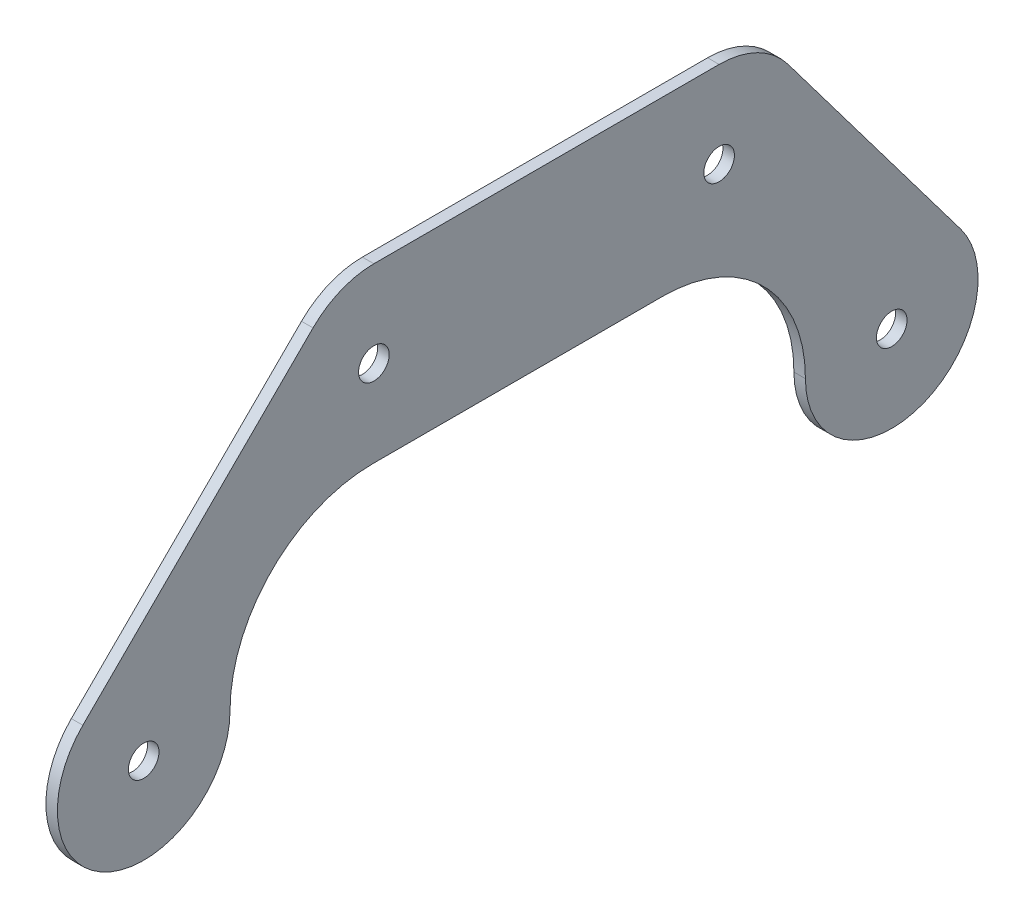
ISO-10303-21;
HEADER;
FILE_DESCRIPTION(('STEP AP214'),'2;1');
FILE_NAME('part.step','',(''),(''),'','','');
FILE_SCHEMA(('AUTOMOTIVE_DESIGN { 1 0 10303 214 1 1 1 1 }'));
ENDSEC;
DATA;
#1=APPLICATION_CONTEXT('core data for automotive mechanical design processes');
#2=APPLICATION_PROTOCOL_DEFINITION('international standard','automotive_design',2000,#1);
#3=PRODUCT_CONTEXT('',#1,'mechanical');
#4=PRODUCT('Part','Part','',(#3));
#5=PRODUCT_RELATED_PRODUCT_CATEGORY('part','',(#4));
#6=PRODUCT_DEFINITION_FORMATION('','',#4);
#7=PRODUCT_DEFINITION_CONTEXT('part definition',#1,'design');
#8=PRODUCT_DEFINITION('design','',#6,#7);
#9=PRODUCT_DEFINITION_SHAPE('','',#8);
#10=(LENGTH_UNIT() NAMED_UNIT(*) SI_UNIT(.MILLI.,.METRE.));
#11=(NAMED_UNIT(*) PLANE_ANGLE_UNIT() SI_UNIT($,.RADIAN.));
#12=(NAMED_UNIT(*) SI_UNIT($,.STERADIAN.) SOLID_ANGLE_UNIT());
#13=UNCERTAINTY_MEASURE_WITH_UNIT(LENGTH_MEASURE(1.E-05),#10,'distance_accuracy_value','');
#14=(GEOMETRIC_REPRESENTATION_CONTEXT(3) GLOBAL_UNCERTAINTY_ASSIGNED_CONTEXT((#13)) GLOBAL_UNIT_ASSIGNED_CONTEXT((#10,
#11,#12)) REPRESENTATION_CONTEXT('',''));
#15=CARTESIAN_POINT('',(0.,0.,0.));
#16=DIRECTION('',(0.,0.,1.));
#17=DIRECTION('',(1.,0.,0.));
#18=AXIS2_PLACEMENT_3D('',#15,#16,#17);
#19=CARTESIAN_POINT('',(2.54,13.5041021309131,13.4365816202585));
#20=DIRECTION('',(0.,0.708876752278901,0.705332368517507));
#21=DIRECTION('',(0.,-0.705332368517507,0.708876752278901));
#22=AXIS2_PLACEMENT_3D('',#19,#20,#21);
#23=PLANE('',#22);
#24=DIRECTION('',(0.,0.705332368517508,-0.708876752278902));
#25=VECTOR('',#24,1.);
#26=CARTESIAN_POINT('',(0.,13.5041021309131,13.4365816202585));
#27=LINE('',#26,#25);
#28=CARTESIAN_POINT('',(0.,13.5041021309131,13.4365816202585));
#29=VERTEX_POINT('',#28);
#30=CARTESIAN_POINT('',(0.,64.0501021309131,-37.3634183797415));
#31=VERTEX_POINT('',#30);
#32=EDGE_CURVE('E164',#29,#31,#27,.T.);
#33=ORIENTED_EDGE('',*,*,#32,.F.);
#34=DIRECTION('',(-1.,0.,0.));
#35=VECTOR('',#34,1.);
#36=CARTESIAN_POINT('',(2.54,13.5041021309131,13.4365816202585));
#37=LINE('',#36,#35);
#38=CARTESIAN_POINT('',(2.54,13.5041021309131,13.4365816202585));
#39=VERTEX_POINT('',#38);
#40=EDGE_CURVE('E11',#39,#29,#37,.T.);
#41=ORIENTED_EDGE('',*,*,#40,.F.);
#42=DIRECTION('',(0.,0.705332368517508,-0.708876752278902));
#43=VECTOR('',#42,1.);
#44=CARTESIAN_POINT('',(2.54,13.5041021309131,13.4365816202585));
#45=LINE('',#44,#43);
#46=CARTESIAN_POINT('',(2.54,64.0501021309131,-37.3634183797415));
#47=VERTEX_POINT('',#46);
#48=EDGE_CURVE('E197',#39,#47,#45,.T.);
#49=ORIENTED_EDGE('',*,*,#48,.T.);
#50=DIRECTION('',(-1.,0.,0.));
#51=VECTOR('',#50,1.);
#52=CARTESIAN_POINT('',(2.54,64.0501021309131,-37.3634183797415));
#53=LINE('',#52,#51);
#54=EDGE_CURVE('E44',#47,#31,#53,.T.);
#55=ORIENTED_EDGE('',*,*,#54,.T.);
#56=EDGE_LOOP('',(#33,#41,#49,#55));
#57=FACE_BOUND('',#56,.T.);
#58=ADVANCED_FACE('F41',(#57),#23,.T.);
#59=CARTESIAN_POINT('',(2.54,0.,0.));
#60=DIRECTION('',(-1.,0.,0.));
#61=DIRECTION('',(0.,0.,1.));
#62=AXIS2_PLACEMENT_3D('',#59,#60,#61);
#63=CYLINDRICAL_SURFACE('',#62,19.05);
#64=CARTESIAN_POINT('',(0.,0.,0.));
#65=DIRECTION('',(1.,0.,0.));
#66=DIRECTION('',(0.,0.,-1.));
#67=AXIS2_PLACEMENT_3D('',#64,#65,#66);
#68=CIRCLE('',#67,19.05);
#69=CARTESIAN_POINT('',(0.,0.,-19.05));
#70=VERTEX_POINT('',#69);
#71=EDGE_CURVE('E196',#29,#70,#68,.T.);
#72=ORIENTED_EDGE('',*,*,#71,.T.);
#73=DIRECTION('',(-1.,0.,0.));
#74=VECTOR('',#73,1.);
#75=CARTESIAN_POINT('',(2.54,0.,-19.05));
#76=LINE('',#75,#74);
#77=CARTESIAN_POINT('',(2.54,0.,-19.05));
#78=VERTEX_POINT('',#77);
#79=EDGE_CURVE('E50',#78,#70,#76,.T.);
#80=ORIENTED_EDGE('',*,*,#79,.F.);
#81=CARTESIAN_POINT('',(2.54,0.,0.));
#82=DIRECTION('',(1.,0.,0.));
#83=DIRECTION('',(0.,0.,-1.));
#84=AXIS2_PLACEMENT_3D('',#81,#82,#83);
#85=CIRCLE('',#84,19.05);
#86=EDGE_CURVE('E155',#39,#78,#85,.T.);
#87=ORIENTED_EDGE('',*,*,#86,.F.);
#88=ORIENTED_EDGE('',*,*,#40,.T.);
#89=EDGE_LOOP('',(#72,#80,#87,#88));
#90=FACE_BOUND('',#89,.T.);
#91=ADVANCED_FACE('F223',(#90),#63,.T.);
#92=CARTESIAN_POINT('',(2.54,0.,-50.546));
#93=DIRECTION('',(-1.,0.,0.));
#94=DIRECTION('',(0.,0.,1.));
#95=AXIS2_PLACEMENT_3D('',#92,#93,#94);
#96=CYLINDRICAL_SURFACE('',#95,31.496);
#97=CARTESIAN_POINT('',(0.,0.,-50.546));
#98=DIRECTION('',(1.,0.,0.));
#99=DIRECTION('',(0.,0.,-1.));
#100=AXIS2_PLACEMENT_3D('',#97,#98,#99);
#101=CIRCLE('',#100,31.496);
#102=CARTESIAN_POINT('',(0.,31.496,-50.546));
#103=VERTEX_POINT('',#102);
#104=EDGE_CURVE('E141',#103,#70,#101,.T.);
#105=ORIENTED_EDGE('',*,*,#104,.F.);
#106=DIRECTION('',(-1.,0.,0.));
#107=VECTOR('',#106,1.);
#108=CARTESIAN_POINT('',(2.54,31.496,-50.546));
#109=LINE('',#108,#107);
#110=CARTESIAN_POINT('',(2.54,31.496,-50.546));
#111=VERTEX_POINT('',#110);
#112=EDGE_CURVE('E135',#111,#103,#109,.T.);
#113=ORIENTED_EDGE('',*,*,#112,.F.);
#114=CARTESIAN_POINT('',(2.54,0.,-50.546));
#115=DIRECTION('',(1.,0.,0.));
#116=DIRECTION('',(0.,0.,-1.));
#117=AXIS2_PLACEMENT_3D('',#114,#115,#116);
#118=CIRCLE('',#117,31.496);
#119=EDGE_CURVE('E139',#111,#78,#118,.T.);
#120=ORIENTED_EDGE('',*,*,#119,.T.);
#121=ORIENTED_EDGE('',*,*,#79,.T.);
#122=EDGE_LOOP('',(#105,#113,#120,#121));
#123=FACE_BOUND('',#122,.T.);
#124=ADVANCED_FACE('F137',(#123),#96,.F.);
#125=CARTESIAN_POINT('',(2.54,31.496,-50.546));
#126=DIRECTION('',(0.,1.,0.));
#127=DIRECTION('',(0.,0.,1.));
#128=AXIS2_PLACEMENT_3D('',#125,#126,#127);
#129=PLANE('',#128);
#130=DIRECTION('',(0.,0.,-1.));
#131=VECTOR('',#130,1.);
#132=CARTESIAN_POINT('',(0.,31.496,-50.546));
#133=LINE('',#132,#131);
#134=CARTESIAN_POINT('',(0.,31.496,-114.554));
#135=VERTEX_POINT('',#134);
#136=EDGE_CURVE('E192',#103,#135,#133,.T.);
#137=ORIENTED_EDGE('',*,*,#136,.T.);
#138=DIRECTION('',(-1.,0.,0.));
#139=VECTOR('',#138,1.);
#140=CARTESIAN_POINT('',(2.54,31.496,-114.554));
#141=LINE('',#140,#139);
#142=CARTESIAN_POINT('',(2.54,31.496,-114.554));
#143=VERTEX_POINT('',#142);
#144=EDGE_CURVE('E145',#143,#135,#141,.T.);
#145=ORIENTED_EDGE('',*,*,#144,.F.);
#146=DIRECTION('',(0.,0.,-1.));
#147=VECTOR('',#146,1.);
#148=CARTESIAN_POINT('',(2.54,31.496,-50.546));
#149=LINE('',#148,#147);
#150=EDGE_CURVE('E148',#111,#143,#149,.T.);
#151=ORIENTED_EDGE('',*,*,#150,.F.);
#152=ORIENTED_EDGE('',*,*,#112,.T.);
#153=EDGE_LOOP('',(#137,#145,#151,#152));
#154=FACE_BOUND('',#153,.T.);
#155=ADVANCED_FACE('F149',(#154),#129,.F.);
#156=CARTESIAN_POINT('',(2.54,-2.61325812841072E-13,-114.554));
#157=DIRECTION('',(-1.,0.,0.));
#158=DIRECTION('',(0.,0.,1.));
#159=AXIS2_PLACEMENT_3D('',#156,#157,#158);
#160=CYLINDRICAL_SURFACE('',#159,31.4960000000003);
#161=CARTESIAN_POINT('',(0.,-2.61325812841072E-13,-114.554));
#162=DIRECTION('',(1.,0.,0.));
#163=DIRECTION('',(0.,0.,-1.));
#164=AXIS2_PLACEMENT_3D('',#161,#162,#163);
#165=CIRCLE('',#164,31.4960000000003);
#166=CARTESIAN_POINT('',(0.,0.,-146.05));
#167=VERTEX_POINT('',#166);
#168=EDGE_CURVE('E189',#167,#135,#165,.T.);
#169=ORIENTED_EDGE('',*,*,#168,.F.);
#170=DIRECTION('',(-1.,0.,0.));
#171=VECTOR('',#170,1.);
#172=CARTESIAN_POINT('',(2.54,0.,-146.05));
#173=LINE('',#172,#171);
#174=CARTESIAN_POINT('',(2.54,0.,-146.05));
#175=VERTEX_POINT('',#174);
#176=EDGE_CURVE('E201',#175,#167,#173,.T.);
#177=ORIENTED_EDGE('',*,*,#176,.F.);
#178=CARTESIAN_POINT('',(2.54,-2.61325812841072E-13,-114.554));
#179=DIRECTION('',(1.,0.,0.));
#180=DIRECTION('',(0.,0.,-1.));
#181=AXIS2_PLACEMENT_3D('',#178,#179,#180);
#182=CIRCLE('',#181,31.4960000000003);
#183=EDGE_CURVE('E152',#175,#143,#182,.T.);
#184=ORIENTED_EDGE('',*,*,#183,.T.);
#185=ORIENTED_EDGE('',*,*,#144,.T.);
#186=EDGE_LOOP('',(#169,#177,#184,#185));
#187=FACE_BOUND('',#186,.T.);
#188=ADVANCED_FACE('F251',(#187),#160,.F.);
#189=CARTESIAN_POINT('',(2.54,1.38777878078145E-13,-165.1));
#190=DIRECTION('',(-1.,0.,0.));
#191=DIRECTION('',(0.,0.,1.));
#192=AXIS2_PLACEMENT_3D('',#189,#190,#191);
#193=CYLINDRICAL_SURFACE('',#192,19.05);
#194=CARTESIAN_POINT('',(0.,1.38777878078145E-13,-165.1));
#195=DIRECTION('',(1.,0.,0.));
#196=DIRECTION('',(0.,0.,-1.));
#197=AXIS2_PLACEMENT_3D('',#194,#195,#196);
#198=CIRCLE('',#197,19.05);
#199=CARTESIAN_POINT('',(0.,11.4666601826353,-180.312435842296));
#200=VERTEX_POINT('',#199);
#201=EDGE_CURVE('E185',#167,#200,#198,.T.);
#202=ORIENTED_EDGE('',*,*,#201,.T.);
#203=DIRECTION('',(-1.,0.,0.));
#204=VECTOR('',#203,1.);
#205=CARTESIAN_POINT('',(2.54,11.4666601826353,-180.312435842296));
#206=LINE('',#205,#204);
#207=CARTESIAN_POINT('',(2.54,11.4666601826353,-180.312435842296));
#208=VERTEX_POINT('',#207);
#209=EDGE_CURVE('E204',#208,#200,#206,.T.);
#210=ORIENTED_EDGE('',*,*,#209,.F.);
#211=CARTESIAN_POINT('',(2.54,1.38777878078145E-13,-165.1));
#212=DIRECTION('',(1.,0.,0.));
#213=DIRECTION('',(0.,0.,-1.));
#214=AXIS2_PLACEMENT_3D('',#211,#212,#213);
#215=CIRCLE('',#214,19.05);
#216=EDGE_CURVE('E245',#175,#208,#215,.T.);
#217=ORIENTED_EDGE('',*,*,#216,.F.);
#218=ORIENTED_EDGE('',*,*,#176,.T.);
#219=EDGE_LOOP('',(#202,#210,#217,#218));
#220=FACE_BOUND('',#219,.T.);
#221=ADVANCED_FACE('F256',(#220),#193,.T.);
#222=CARTESIAN_POINT('',(2.54,62.0126601826352,-142.212435842296));
#223=DIRECTION('',(0.,0.601924419035966,-0.798553062587712));
#224=DIRECTION('',(0.,0.798553062587712,0.601924419035966));
#225=AXIS2_PLACEMENT_3D('',#222,#223,#224);
#226=PLANE('',#225);
#227=DIRECTION('',(0.,-0.798553062587712,-0.601924419035966));
#228=VECTOR('',#227,1.);
#229=CARTESIAN_POINT('',(0.,62.0126601826352,-142.212435842296));
#230=LINE('',#229,#228);
#231=CARTESIAN_POINT('',(0.,62.0126601826352,-142.212435842296));
#232=VERTEX_POINT('',#231);
#233=EDGE_CURVE('E181',#232,#200,#230,.T.);
#234=ORIENTED_EDGE('',*,*,#233,.F.);
#235=DIRECTION('',(-1.,0.,0.));
#236=VECTOR('',#235,1.);
#237=CARTESIAN_POINT('',(2.54,62.0126601826352,-142.212435842296));
#238=LINE('',#237,#236);
#239=CARTESIAN_POINT('',(2.54,62.0126601826352,-142.212435842296));
#240=VERTEX_POINT('',#239);
#241=EDGE_CURVE('E207',#240,#232,#238,.T.);
#242=ORIENTED_EDGE('',*,*,#241,.F.);
#243=DIRECTION('',(0.,-0.798553062587712,-0.601924419035966));
#244=VECTOR('',#243,1.);
#245=CARTESIAN_POINT('',(2.54,62.0126601826352,-142.212435842296));
#246=LINE('',#245,#244);
#247=EDGE_CURVE('E241',#240,#208,#246,.T.);
#248=ORIENTED_EDGE('',*,*,#247,.T.);
#249=ORIENTED_EDGE('',*,*,#209,.T.);
#250=EDGE_LOOP('',(#234,#242,#248,#249));
#251=FACE_BOUND('',#250,.T.);
#252=ADVANCED_FACE('F260',(#251),#226,.T.);
#253=CARTESIAN_POINT('',(2.54,50.546,-127.));
#254=DIRECTION('',(-1.,0.,0.));
#255=DIRECTION('',(0.,0.,1.));
#256=AXIS2_PLACEMENT_3D('',#253,#254,#255);
#257=CYLINDRICAL_SURFACE('',#256,19.05);
#258=CARTESIAN_POINT('',(0.,50.546,-127.));
#259=DIRECTION('',(1.,0.,0.));
#260=DIRECTION('',(0.,0.,-1.));
#261=AXIS2_PLACEMENT_3D('',#258,#259,#260);
#262=CIRCLE('',#261,19.05);
#263=CARTESIAN_POINT('',(0.,69.596,-127.));
#264=VERTEX_POINT('',#263);
#265=EDGE_CURVE('E177',#232,#264,#262,.T.);
#266=ORIENTED_EDGE('',*,*,#265,.T.);
#267=DIRECTION('',(-1.,0.,0.));
#268=VECTOR('',#267,1.);
#269=CARTESIAN_POINT('',(2.54,69.596,-127.));
#270=LINE('',#269,#268);
#271=CARTESIAN_POINT('',(2.54,69.596,-127.));
#272=VERTEX_POINT('',#271);
#273=EDGE_CURVE('E210',#272,#264,#270,.T.);
#274=ORIENTED_EDGE('',*,*,#273,.F.);
#275=CARTESIAN_POINT('',(2.54,50.546,-127.));
#276=DIRECTION('',(1.,0.,0.));
#277=DIRECTION('',(0.,0.,-1.));
#278=AXIS2_PLACEMENT_3D('',#275,#276,#277);
#279=CIRCLE('',#278,19.05);
#280=EDGE_CURVE('E238',#240,#272,#279,.T.);
#281=ORIENTED_EDGE('',*,*,#280,.F.);
#282=ORIENTED_EDGE('',*,*,#241,.T.);
#283=EDGE_LOOP('',(#266,#274,#281,#282));
#284=FACE_BOUND('',#283,.T.);
#285=ADVANCED_FACE('F265',(#284),#257,.T.);
#286=CARTESIAN_POINT('',(2.54,69.596,-50.8));
#287=DIRECTION('',(0.,1.,0.));
#288=DIRECTION('',(0.,0.,1.));
#289=AXIS2_PLACEMENT_3D('',#286,#287,#288);
#290=PLANE('',#289);
#291=DIRECTION('',(0.,0.,-1.));
#292=VECTOR('',#291,1.);
#293=CARTESIAN_POINT('',(0.,69.596,-50.8));
#294=LINE('',#293,#292);
#295=CARTESIAN_POINT('',(0.,69.596,-50.8));
#296=VERTEX_POINT('',#295);
#297=EDGE_CURVE('E173',#296,#264,#294,.T.);
#298=ORIENTED_EDGE('',*,*,#297,.F.);
#299=DIRECTION('',(-1.,0.,0.));
#300=VECTOR('',#299,1.);
#301=CARTESIAN_POINT('',(2.54,69.596,-50.8));
#302=LINE('',#301,#300);
#303=CARTESIAN_POINT('',(2.54,69.596,-50.8));
#304=VERTEX_POINT('',#303);
#305=EDGE_CURVE('E212',#304,#296,#302,.T.);
#306=ORIENTED_EDGE('',*,*,#305,.F.);
#307=DIRECTION('',(0.,0.,-1.));
#308=VECTOR('',#307,1.);
#309=CARTESIAN_POINT('',(2.54,69.596,-50.8));
#310=LINE('',#309,#308);
#311=EDGE_CURVE('E230',#304,#272,#310,.T.);
#312=ORIENTED_EDGE('',*,*,#311,.T.);
#313=ORIENTED_EDGE('',*,*,#273,.T.);
#314=EDGE_LOOP('',(#298,#306,#312,#313));
#315=FACE_BOUND('',#314,.T.);
#316=ADVANCED_FACE('F267',(#315),#290,.T.);
#317=CARTESIAN_POINT('',(2.54,50.546,-50.8));
#318=DIRECTION('',(-1.,0.,0.));
#319=DIRECTION('',(0.,0.,1.));
#320=AXIS2_PLACEMENT_3D('',#317,#318,#319);
#321=CYLINDRICAL_SURFACE('',#320,19.05);
#322=CARTESIAN_POINT('',(0.,50.546,-50.8));
#323=DIRECTION('',(1.,0.,0.));
#324=DIRECTION('',(0.,0.,-1.));
#325=AXIS2_PLACEMENT_3D('',#322,#323,#324);
#326=CIRCLE('',#325,19.05);
#327=EDGE_CURVE('E168',#296,#31,#326,.T.);
#328=ORIENTED_EDGE('',*,*,#327,.T.);
#329=ORIENTED_EDGE('',*,*,#54,.F.);
#330=CARTESIAN_POINT('',(2.54,50.546,-50.8));
#331=DIRECTION('',(1.,0.,0.));
#332=DIRECTION('',(0.,0.,-1.));
#333=AXIS2_PLACEMENT_3D('',#330,#331,#332);
#334=CIRCLE('',#333,19.05);
#335=EDGE_CURVE('E110',#304,#47,#334,.T.);
#336=ORIENTED_EDGE('',*,*,#335,.F.);
#337=ORIENTED_EDGE('',*,*,#305,.T.);
#338=EDGE_LOOP('',(#328,#329,#336,#337));
#339=FACE_BOUND('',#338,.T.);
#340=ADVANCED_FACE('F219',(#339),#321,.T.);
#341=CARTESIAN_POINT('',(2.54,50.546,-50.8));
#342=DIRECTION('',(1.,0.,0.));
#343=DIRECTION('',(0.,0.,-1.));
#344=AXIS2_PLACEMENT_3D('',#341,#342,#343);
#345=PLANE('',#344);
#346=CARTESIAN_POINT('',(2.54,50.546,-50.8));
#347=DIRECTION('',(1.,0.,0.));
#348=DIRECTION('',(0.,0.,-1.));
#349=AXIS2_PLACEMENT_3D('',#346,#347,#348);
#350=CIRCLE('',#349,3.37819999999998);
#351=CARTESIAN_POINT('',(2.54,50.546,-54.1782));
#352=VERTEX_POINT('',#351);
#353=EDGE_CURVE('E408',#352,#352,#350,.T.);
#354=ORIENTED_EDGE('',*,*,#353,.F.);
#355=EDGE_LOOP('',(#354));
#356=FACE_BOUND('',#355,.T.);
#357=CARTESIAN_POINT('',(2.54,50.546,-127.));
#358=DIRECTION('',(1.,0.,0.));
#359=DIRECTION('',(0.,0.,-1.));
#360=AXIS2_PLACEMENT_3D('',#357,#358,#359);
#361=CIRCLE('',#360,3.37819999999998);
#362=CARTESIAN_POINT('',(2.54,50.546,-130.3782));
#363=VERTEX_POINT('',#362);
#364=EDGE_CURVE('E334',#363,#363,#361,.T.);
#365=ORIENTED_EDGE('',*,*,#364,.F.);
#366=EDGE_LOOP('',(#365));
#367=FACE_BOUND('',#366,.T.);
#368=CARTESIAN_POINT('',(2.54,1.38777878078145E-13,-165.1));
#369=DIRECTION('',(1.,0.,0.));
#370=DIRECTION('',(0.,0.,-1.));
#371=AXIS2_PLACEMENT_3D('',#368,#369,#370);
#372=CIRCLE('',#371,3.37819999999999);
#373=CARTESIAN_POINT('',(2.54,1.38777878078145E-13,-168.4782));
#374=VERTEX_POINT('',#373);
#375=EDGE_CURVE('E333',#374,#374,#372,.T.);
#376=ORIENTED_EDGE('',*,*,#375,.F.);
#377=EDGE_LOOP('',(#376));
#378=FACE_BOUND('',#377,.T.);
#379=CARTESIAN_POINT('',(2.54,0.,0.));
#380=DIRECTION('',(1.,0.,0.));
#381=DIRECTION('',(0.,0.,-1.));
#382=AXIS2_PLACEMENT_3D('',#379,#380,#381);
#383=CIRCLE('',#382,3.37819999999999);
#384=CARTESIAN_POINT('',(2.54,0.,-3.37819999999999));
#385=VERTEX_POINT('',#384);
#386=EDGE_CURVE('E374',#385,#385,#383,.T.);
#387=ORIENTED_EDGE('',*,*,#386,.F.);
#388=EDGE_LOOP('',(#387));
#389=FACE_BOUND('',#388,.T.);
#390=ORIENTED_EDGE('',*,*,#48,.F.);
#391=ORIENTED_EDGE('',*,*,#86,.T.);
#392=ORIENTED_EDGE('',*,*,#119,.F.);
#393=ORIENTED_EDGE('',*,*,#150,.T.);
#394=ORIENTED_EDGE('',*,*,#183,.F.);
#395=ORIENTED_EDGE('',*,*,#216,.T.);
#396=ORIENTED_EDGE('',*,*,#247,.F.);
#397=ORIENTED_EDGE('',*,*,#280,.T.);
#398=ORIENTED_EDGE('',*,*,#311,.F.);
#399=ORIENTED_EDGE('',*,*,#335,.T.);
#400=EDGE_LOOP('',(#390,#391,#392,#393,#394,#395,#396,#397,#398,#399));
#401=FACE_BOUND('',#400,.T.);
#402=ADVANCED_FACE('F154',(#356,#367,#378,#389,#401),#345,.T.);
#403=CARTESIAN_POINT('',(0.,50.546,-50.8));
#404=DIRECTION('',(1.,0.,0.));
#405=DIRECTION('',(0.,0.,-1.));
#406=AXIS2_PLACEMENT_3D('',#403,#404,#405);
#407=PLANE('',#406);
#408=CARTESIAN_POINT('',(0.,50.546,-50.8));
#409=DIRECTION('',(1.,0.,0.));
#410=DIRECTION('',(0.,0.,-1.));
#411=AXIS2_PLACEMENT_3D('',#408,#409,#410);
#412=CIRCLE('',#411,3.3782);
#413=CARTESIAN_POINT('',(0.,50.546,-54.1782));
#414=VERTEX_POINT('',#413);
#415=EDGE_CURVE('E349',#414,#414,#412,.T.);
#416=ORIENTED_EDGE('',*,*,#415,.T.);
#417=EDGE_LOOP('',(#416));
#418=FACE_BOUND('',#417,.T.);
#419=CARTESIAN_POINT('',(0.,50.546,-127.));
#420=DIRECTION('',(1.,0.,0.));
#421=DIRECTION('',(0.,0.,-1.));
#422=AXIS2_PLACEMENT_3D('',#419,#420,#421);
#423=CIRCLE('',#422,3.3782);
#424=CARTESIAN_POINT('',(0.,50.546,-130.3782));
#425=VERTEX_POINT('',#424);
#426=EDGE_CURVE('E328',#425,#425,#423,.T.);
#427=ORIENTED_EDGE('',*,*,#426,.T.);
#428=EDGE_LOOP('',(#427));
#429=FACE_BOUND('',#428,.T.);
#430=CARTESIAN_POINT('',(0.,1.38777878078145E-13,-165.1));
#431=DIRECTION('',(1.,0.,0.));
#432=DIRECTION('',(0.,0.,-1.));
#433=AXIS2_PLACEMENT_3D('',#430,#431,#432);
#434=CIRCLE('',#433,3.3782);
#435=CARTESIAN_POINT('',(0.,1.38777878078145E-13,-168.4782));
#436=VERTEX_POINT('',#435);
#437=EDGE_CURVE('E370',#436,#436,#434,.T.);
#438=ORIENTED_EDGE('',*,*,#437,.T.);
#439=EDGE_LOOP('',(#438));
#440=FACE_BOUND('',#439,.T.);
#441=CARTESIAN_POINT('',(0.,0.,0.));
#442=DIRECTION('',(1.,0.,0.));
#443=DIRECTION('',(0.,0.,-1.));
#444=AXIS2_PLACEMENT_3D('',#441,#442,#443);
#445=CIRCLE('',#444,3.3782);
#446=CARTESIAN_POINT('',(0.,0.,-3.3782));
#447=VERTEX_POINT('',#446);
#448=EDGE_CURVE('E169',#447,#447,#445,.T.);
#449=ORIENTED_EDGE('',*,*,#448,.T.);
#450=EDGE_LOOP('',(#449));
#451=FACE_BOUND('',#450,.T.);
#452=ORIENTED_EDGE('',*,*,#32,.T.);
#453=ORIENTED_EDGE('',*,*,#327,.F.);
#454=ORIENTED_EDGE('',*,*,#297,.T.);
#455=ORIENTED_EDGE('',*,*,#265,.F.);
#456=ORIENTED_EDGE('',*,*,#233,.T.);
#457=ORIENTED_EDGE('',*,*,#201,.F.);
#458=ORIENTED_EDGE('',*,*,#168,.T.);
#459=ORIENTED_EDGE('',*,*,#136,.F.);
#460=ORIENTED_EDGE('',*,*,#104,.T.);
#461=ORIENTED_EDGE('',*,*,#71,.F.);
#462=EDGE_LOOP('',(#452,#453,#454,#455,#456,#457,#458,#459,#460,#461));
#463=FACE_BOUND('',#462,.T.);
#464=ADVANCED_FACE('F222',(#418,#429,#440,#451,#463),#407,.F.);
#465=CARTESIAN_POINT('',(2.54,0.,0.));
#466=DIRECTION('',(1.,0.,0.));
#467=DIRECTION('',(0.,0.,-1.));
#468=AXIS2_PLACEMENT_3D('',#465,#466,#467);
#469=CYLINDRICAL_SURFACE('',#468,3.37819999999999);
#470=ORIENTED_EDGE('',*,*,#448,.F.);
#471=EDGE_LOOP('',(#470));
#472=FACE_BOUND('',#471,.T.);
#473=ORIENTED_EDGE('',*,*,#386,.T.);
#474=EDGE_LOOP('',(#473));
#475=FACE_BOUND('',#474,.T.);
#476=ADVANCED_FACE('F362',(#472,#475),#469,.F.);
#477=CARTESIAN_POINT('',(2.54,1.38777878078145E-13,-165.1));
#478=DIRECTION('',(1.,0.,0.));
#479=DIRECTION('',(0.,0.,-1.));
#480=AXIS2_PLACEMENT_3D('',#477,#478,#479);
#481=CYLINDRICAL_SURFACE('',#480,3.37819999999999);
#482=ORIENTED_EDGE('',*,*,#437,.F.);
#483=EDGE_LOOP('',(#482));
#484=FACE_BOUND('',#483,.T.);
#485=ORIENTED_EDGE('',*,*,#375,.T.);
#486=EDGE_LOOP('',(#485));
#487=FACE_BOUND('',#486,.T.);
#488=ADVANCED_FACE('F318',(#484,#487),#481,.F.);
#489=CARTESIAN_POINT('',(2.54,50.546,-127.));
#490=DIRECTION('',(1.,0.,0.));
#491=DIRECTION('',(0.,0.,-1.));
#492=AXIS2_PLACEMENT_3D('',#489,#490,#491);
#493=CYLINDRICAL_SURFACE('',#492,3.37819999999999);
#494=ORIENTED_EDGE('',*,*,#426,.F.);
#495=EDGE_LOOP('',(#494));
#496=FACE_BOUND('',#495,.T.);
#497=ORIENTED_EDGE('',*,*,#364,.T.);
#498=EDGE_LOOP('',(#497));
#499=FACE_BOUND('',#498,.T.);
#500=ADVANCED_FACE('F312',(#496,#499),#493,.F.);
#501=CARTESIAN_POINT('',(2.54,50.546,-50.8));
#502=DIRECTION('',(1.,0.,0.));
#503=DIRECTION('',(0.,0.,-1.));
#504=AXIS2_PLACEMENT_3D('',#501,#502,#503);
#505=CYLINDRICAL_SURFACE('',#504,3.37819999999999);
#506=ORIENTED_EDGE('',*,*,#415,.F.);
#507=EDGE_LOOP('',(#506));
#508=FACE_BOUND('',#507,.T.);
#509=ORIENTED_EDGE('',*,*,#353,.T.);
#510=EDGE_LOOP('',(#509));
#511=FACE_BOUND('',#510,.T.);
#512=ADVANCED_FACE('F317',(#508,#511),#505,.F.);
#513=CLOSED_SHELL('',(#58,#91,#124,#155,#188,#221,#252,#285,#316,#340,#402,#464,#476,#488,#500,#512));
#514=MANIFOLD_SOLID_BREP('B2',#513);
#515=ADVANCED_BREP_SHAPE_REPRESENTATION('',(#18,#514),#14);
#516=SHAPE_DEFINITION_REPRESENTATION(#9,#515);
ENDSEC;
END-ISO-10303-21;
